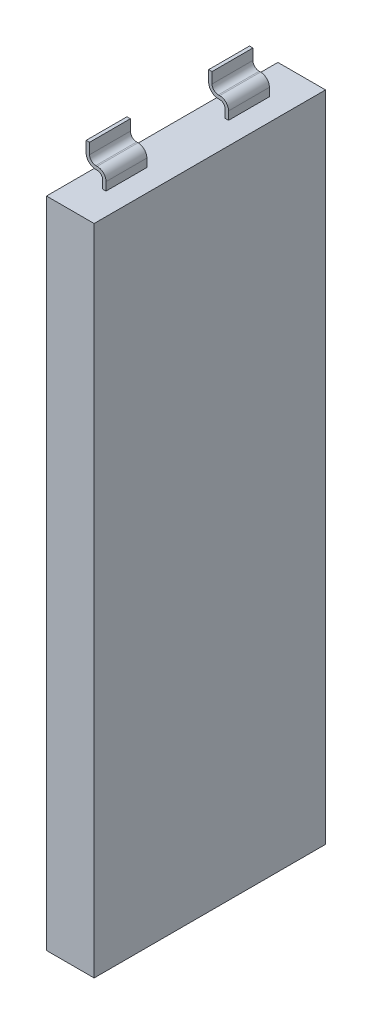
ISO-10303-21;
HEADER;
FILE_DESCRIPTION(('STEP AP214'),'2;1');
FILE_NAME('part.step','',(''),(''),'','','');
FILE_SCHEMA(('AUTOMOTIVE_DESIGN { 1 0 10303 214 1 1 1 1 }'));
ENDSEC;
DATA;
#1=APPLICATION_CONTEXT('core data for automotive mechanical design processes');
#2=APPLICATION_PROTOCOL_DEFINITION('international standard','automotive_design',2000,#1);
#3=PRODUCT_CONTEXT('',#1,'mechanical');
#4=PRODUCT('Part','Part','',(#3));
#5=PRODUCT_RELATED_PRODUCT_CATEGORY('part','',(#4));
#6=PRODUCT_DEFINITION_FORMATION('','',#4);
#7=PRODUCT_DEFINITION_CONTEXT('part definition',#1,'design');
#8=PRODUCT_DEFINITION('design','',#6,#7);
#9=PRODUCT_DEFINITION_SHAPE('','',#8);
#10=(LENGTH_UNIT() NAMED_UNIT(*) SI_UNIT(.MILLI.,.METRE.));
#11=(NAMED_UNIT(*) PLANE_ANGLE_UNIT() SI_UNIT($,.RADIAN.));
#12=(NAMED_UNIT(*) SI_UNIT($,.STERADIAN.) SOLID_ANGLE_UNIT());
#13=UNCERTAINTY_MEASURE_WITH_UNIT(LENGTH_MEASURE(1.E-05),#10,'distance_accuracy_value','');
#14=(GEOMETRIC_REPRESENTATION_CONTEXT(3) GLOBAL_UNCERTAINTY_ASSIGNED_CONTEXT((#13)) GLOBAL_UNIT_ASSIGNED_CONTEXT((#10,
#11,#12)) REPRESENTATION_CONTEXT('',''));
#15=CARTESIAN_POINT('',(0.,0.,0.));
#16=DIRECTION('',(0.,0.,1.));
#17=DIRECTION('',(1.,0.,0.));
#18=AXIS2_PLACEMENT_3D('',#15,#16,#17);
#19=CARTESIAN_POINT('',(7.,48.,17.));
#20=DIRECTION('',(0.,0.,-1.));
#21=DIRECTION('',(0.,1.,0.));
#22=AXIS2_PLACEMENT_3D('',#19,#20,#21);
#23=PLANE('',#22);
#24=DIRECTION('',(0.,-1.,0.));
#25=VECTOR('',#24,1.);
#26=CARTESIAN_POINT('',(0.,48.,17.));
#27=LINE('',#26,#25);
#28=CARTESIAN_POINT('',(0.,48.,17.));
#29=VERTEX_POINT('',#28);
#30=CARTESIAN_POINT('',(0.,-48.,17.));
#31=VERTEX_POINT('',#30);
#32=EDGE_CURVE('E407',#29,#31,#27,.T.);
#33=ORIENTED_EDGE('',*,*,#32,.T.);
#34=DIRECTION('',(-1.,0.,0.));
#35=VECTOR('',#34,1.);
#36=CARTESIAN_POINT('',(7.,-48.,17.));
#37=LINE('',#36,#35);
#38=CARTESIAN_POINT('',(7.,-48.,17.));
#39=VERTEX_POINT('',#38);
#40=EDGE_CURVE('E11',#39,#31,#37,.T.);
#41=ORIENTED_EDGE('',*,*,#40,.F.);
#42=DIRECTION('',(0.,-1.,0.));
#43=VECTOR('',#42,1.);
#44=CARTESIAN_POINT('',(7.,48.,17.));
#45=LINE('',#44,#43);
#46=CARTESIAN_POINT('',(7.,48.,17.));
#47=VERTEX_POINT('',#46);
#48=EDGE_CURVE('E408',#47,#39,#45,.T.);
#49=ORIENTED_EDGE('',*,*,#48,.F.);
#50=DIRECTION('',(-1.,0.,0.));
#51=VECTOR('',#50,1.);
#52=CARTESIAN_POINT('',(7.,48.,17.));
#53=LINE('',#52,#51);
#54=EDGE_CURVE('E418',#47,#29,#53,.T.);
#55=ORIENTED_EDGE('',*,*,#54,.T.);
#56=EDGE_LOOP('',(#33,#41,#49,#55));
#57=FACE_BOUND('',#56,.T.);
#58=ADVANCED_FACE('F36',(#57),#23,.F.);
#59=CARTESIAN_POINT('',(7.,-48.,17.));
#60=DIRECTION('',(0.,1.,0.));
#61=DIRECTION('',(0.,0.,1.));
#62=AXIS2_PLACEMENT_3D('',#59,#60,#61);
#63=PLANE('',#62);
#64=DIRECTION('',(0.,0.,-1.));
#65=VECTOR('',#64,1.);
#66=CARTESIAN_POINT('',(0.,-48.,17.));
#67=LINE('',#66,#65);
#68=CARTESIAN_POINT('',(0.,-48.,-17.));
#69=VERTEX_POINT('',#68);
#70=EDGE_CURVE('E421',#31,#69,#67,.T.);
#71=ORIENTED_EDGE('',*,*,#70,.T.);
#72=DIRECTION('',(-1.,0.,0.));
#73=VECTOR('',#72,1.);
#74=CARTESIAN_POINT('',(7.,-48.,-17.));
#75=LINE('',#74,#73);
#76=CARTESIAN_POINT('',(7.,-48.,-17.));
#77=VERTEX_POINT('',#76);
#78=EDGE_CURVE('E43',#77,#69,#75,.T.);
#79=ORIENTED_EDGE('',*,*,#78,.F.);
#80=DIRECTION('',(0.,0.,-1.));
#81=VECTOR('',#80,1.);
#82=CARTESIAN_POINT('',(7.,-48.,17.));
#83=LINE('',#82,#81);
#84=EDGE_CURVE('E411',#39,#77,#83,.T.);
#85=ORIENTED_EDGE('',*,*,#84,.F.);
#86=ORIENTED_EDGE('',*,*,#40,.T.);
#87=EDGE_LOOP('',(#71,#79,#85,#86));
#88=FACE_BOUND('',#87,.T.);
#89=ADVANCED_FACE('F451',(#88),#63,.F.);
#90=CARTESIAN_POINT('',(7.,48.,-17.));
#91=DIRECTION('',(0.,0.,1.));
#92=DIRECTION('',(0.,-1.,0.));
#93=AXIS2_PLACEMENT_3D('',#90,#91,#92);
#94=PLANE('',#93);
#95=DIRECTION('',(0.,1.,0.));
#96=VECTOR('',#95,1.);
#97=CARTESIAN_POINT('',(0.,48.,-17.));
#98=LINE('',#97,#96);
#99=CARTESIAN_POINT('',(0.,48.,-17.));
#100=VERTEX_POINT('',#99);
#101=EDGE_CURVE('E423',#69,#100,#98,.T.);
#102=ORIENTED_EDGE('',*,*,#101,.T.);
#103=DIRECTION('',(-1.,0.,0.));
#104=VECTOR('',#103,1.);
#105=CARTESIAN_POINT('',(7.,48.,-17.));
#106=LINE('',#105,#104);
#107=CARTESIAN_POINT('',(7.,48.,-17.));
#108=VERTEX_POINT('',#107);
#109=EDGE_CURVE('E428',#108,#100,#106,.T.);
#110=ORIENTED_EDGE('',*,*,#109,.F.);
#111=DIRECTION('',(0.,1.,0.));
#112=VECTOR('',#111,1.);
#113=CARTESIAN_POINT('',(7.,48.,-17.));
#114=LINE('',#113,#112);
#115=EDGE_CURVE('E414',#77,#108,#114,.T.);
#116=ORIENTED_EDGE('',*,*,#115,.F.);
#117=ORIENTED_EDGE('',*,*,#78,.T.);
#118=EDGE_LOOP('',(#102,#110,#116,#117));
#119=FACE_BOUND('',#118,.T.);
#120=ADVANCED_FACE('F435',(#119),#94,.F.);
#121=CARTESIAN_POINT('',(7.,48.,17.));
#122=DIRECTION('',(0.,-1.,0.));
#123=DIRECTION('',(0.,0.,-1.));
#124=AXIS2_PLACEMENT_3D('',#121,#122,#123);
#125=PLANE('',#124);
#126=DIRECTION('',(0.,0.,1.));
#127=VECTOR('',#126,1.);
#128=CARTESIAN_POINT('',(3.25,48.,-12.));
#129=LINE('',#128,#127);
#130=CARTESIAN_POINT('',(3.25,48.,-12.));
#131=VERTEX_POINT('',#130);
#132=CARTESIAN_POINT('',(3.25,48.,-6.));
#133=VERTEX_POINT('',#132);
#134=EDGE_CURVE('E50',#131,#133,#129,.T.);
#135=ORIENTED_EDGE('',*,*,#134,.F.);
#136=DIRECTION('',(1.,0.,0.));
#137=VECTOR('',#136,1.);
#138=CARTESIAN_POINT('',(3.25,48.,-12.));
#139=LINE('',#138,#137);
#140=CARTESIAN_POINT('',(3.75,48.,-12.));
#141=VERTEX_POINT('',#140);
#142=EDGE_CURVE('E54',#131,#141,#139,.T.);
#143=ORIENTED_EDGE('',*,*,#142,.T.);
#144=DIRECTION('',(0.,0.,1.));
#145=VECTOR('',#144,1.);
#146=CARTESIAN_POINT('',(3.75,48.,-12.));
#147=LINE('',#146,#145);
#148=CARTESIAN_POINT('',(3.75,48.,-6.));
#149=VERTEX_POINT('',#148);
#150=EDGE_CURVE('E268',#141,#149,#147,.T.);
#151=ORIENTED_EDGE('',*,*,#150,.T.);
#152=DIRECTION('',(1.,0.,0.));
#153=VECTOR('',#152,1.);
#154=CARTESIAN_POINT('',(3.25,48.,-6.));
#155=LINE('',#154,#153);
#156=EDGE_CURVE('E269',#133,#149,#155,.T.);
#157=ORIENTED_EDGE('',*,*,#156,.F.);
#158=EDGE_LOOP('',(#135,#143,#151,#157));
#159=FACE_BOUND('',#158,.T.);
#160=DIRECTION('',(0.,0.,-1.));
#161=VECTOR('',#160,1.);
#162=CARTESIAN_POINT('',(3.75,48.,12.));
#163=LINE('',#162,#161);
#164=CARTESIAN_POINT('',(3.75,48.,12.));
#165=VERTEX_POINT('',#164);
#166=CARTESIAN_POINT('',(3.75,48.,6.));
#167=VERTEX_POINT('',#166);
#168=EDGE_CURVE('E404',#165,#167,#163,.T.);
#169=ORIENTED_EDGE('',*,*,#168,.F.);
#170=DIRECTION('',(1.,0.,0.));
#171=VECTOR('',#170,1.);
#172=CARTESIAN_POINT('',(3.25,48.,12.));
#173=LINE('',#172,#171);
#174=CARTESIAN_POINT('',(3.25,48.,12.));
#175=VERTEX_POINT('',#174);
#176=EDGE_CURVE('E322',#175,#165,#173,.T.);
#177=ORIENTED_EDGE('',*,*,#176,.F.);
#178=DIRECTION('',(0.,0.,-1.));
#179=VECTOR('',#178,1.);
#180=CARTESIAN_POINT('',(3.25,48.,12.));
#181=LINE('',#180,#179);
#182=CARTESIAN_POINT('',(3.25,48.,6.));
#183=VERTEX_POINT('',#182);
#184=EDGE_CURVE('E349',#175,#183,#181,.T.);
#185=ORIENTED_EDGE('',*,*,#184,.T.);
#186=DIRECTION('',(1.,0.,0.));
#187=VECTOR('',#186,1.);
#188=CARTESIAN_POINT('',(3.25,48.,6.));
#189=LINE('',#188,#187);
#190=EDGE_CURVE('E321',#183,#167,#189,.T.);
#191=ORIENTED_EDGE('',*,*,#190,.T.);
#192=EDGE_LOOP('',(#169,#177,#185,#191));
#193=FACE_BOUND('',#192,.T.);
#194=DIRECTION('',(0.,0.,1.));
#195=VECTOR('',#194,1.);
#196=CARTESIAN_POINT('',(0.,48.,17.));
#197=LINE('',#196,#195);
#198=EDGE_CURVE('E412',#100,#29,#197,.T.);
#199=ORIENTED_EDGE('',*,*,#198,.T.);
#200=ORIENTED_EDGE('',*,*,#54,.F.);
#201=DIRECTION('',(0.,0.,1.));
#202=VECTOR('',#201,1.);
#203=CARTESIAN_POINT('',(7.,48.,17.));
#204=LINE('',#203,#202);
#205=EDGE_CURVE('E416',#108,#47,#204,.T.);
#206=ORIENTED_EDGE('',*,*,#205,.F.);
#207=ORIENTED_EDGE('',*,*,#109,.T.);
#208=EDGE_LOOP('',(#199,#200,#206,#207));
#209=FACE_BOUND('',#208,.T.);
#210=ADVANCED_FACE('F444',(#159,#193,#209),#125,.F.);
#211=CARTESIAN_POINT('',(7.,0.,0.));
#212=DIRECTION('',(1.,0.,0.));
#213=DIRECTION('',(0.,0.,-1.));
#214=AXIS2_PLACEMENT_3D('',#211,#212,#213);
#215=PLANE('',#214);
#216=ORIENTED_EDGE('',*,*,#48,.T.);
#217=ORIENTED_EDGE('',*,*,#84,.T.);
#218=ORIENTED_EDGE('',*,*,#115,.T.);
#219=ORIENTED_EDGE('',*,*,#205,.T.);
#220=EDGE_LOOP('',(#216,#217,#218,#219));
#221=FACE_BOUND('',#220,.T.);
#222=ADVANCED_FACE('F450',(#221),#215,.T.);
#223=CARTESIAN_POINT('',(0.,0.,0.));
#224=DIRECTION('',(1.,0.,0.));
#225=DIRECTION('',(0.,0.,-1.));
#226=AXIS2_PLACEMENT_3D('',#223,#224,#225);
#227=PLANE('',#226);
#228=ORIENTED_EDGE('',*,*,#32,.F.);
#229=ORIENTED_EDGE('',*,*,#198,.F.);
#230=ORIENTED_EDGE('',*,*,#101,.F.);
#231=ORIENTED_EDGE('',*,*,#70,.F.);
#232=EDGE_LOOP('',(#228,#229,#230,#231));
#233=FACE_BOUND('',#232,.T.);
#234=ADVANCED_FACE('F441',(#233),#227,.F.);
#235=CARTESIAN_POINT('',(3.75,48.,12.));
#236=DIRECTION('',(-1.,0.,0.));
#237=DIRECTION('',(0.,-1.,0.));
#238=AXIS2_PLACEMENT_3D('',#235,#236,#237);
#239=PLANE('',#238);
#240=DIRECTION('',(0.,1.,0.));
#241=VECTOR('',#240,1.);
#242=CARTESIAN_POINT('',(3.75,48.,6.));
#243=LINE('',#242,#241);
#244=CARTESIAN_POINT('',(3.75,49.2,6.));
#245=VERTEX_POINT('',#244);
#246=EDGE_CURVE('E351',#167,#245,#243,.T.);
#247=ORIENTED_EDGE('',*,*,#246,.T.);
#248=DIRECTION('',(0.,0.,-1.));
#249=VECTOR('',#248,1.);
#250=CARTESIAN_POINT('',(3.75,49.2,12.));
#251=LINE('',#250,#249);
#252=CARTESIAN_POINT('',(3.75,49.2,12.));
#253=VERTEX_POINT('',#252);
#254=EDGE_CURVE('E401',#253,#245,#251,.T.);
#255=ORIENTED_EDGE('',*,*,#254,.F.);
#256=DIRECTION('',(0.,1.,0.));
#257=VECTOR('',#256,1.);
#258=CARTESIAN_POINT('',(3.75,48.,12.));
#259=LINE('',#258,#257);
#260=EDGE_CURVE('E325',#165,#253,#259,.T.);
#261=ORIENTED_EDGE('',*,*,#260,.F.);
#262=ORIENTED_EDGE('',*,*,#168,.T.);
#263=EDGE_LOOP('',(#247,#255,#261,#262));
#264=FACE_BOUND('',#263,.T.);
#265=ADVANCED_FACE('F463',(#264),#239,.F.);
#266=CARTESIAN_POINT('',(2.45,49.2,12.));
#267=DIRECTION('',(0.,0.,-1.));
#268=DIRECTION('',(-1.,0.,0.));
#269=AXIS2_PLACEMENT_3D('',#266,#267,#268);
#270=CYLINDRICAL_SURFACE('',#269,1.3);
#271=CARTESIAN_POINT('',(2.45,49.2,6.));
#272=DIRECTION('',(0.,0.,1.));
#273=DIRECTION('',(1.,0.,0.));
#274=AXIS2_PLACEMENT_3D('',#271,#272,#273);
#275=CIRCLE('',#274,1.3);
#276=CARTESIAN_POINT('',(2.44999999999999,50.5,6.));
#277=VERTEX_POINT('',#276);
#278=EDGE_CURVE('E353',#245,#277,#275,.T.);
#279=ORIENTED_EDGE('',*,*,#278,.T.);
#280=DIRECTION('',(0.,0.,-1.));
#281=VECTOR('',#280,1.);
#282=CARTESIAN_POINT('',(2.44999999999999,50.5,12.));
#283=LINE('',#282,#281);
#284=CARTESIAN_POINT('',(2.44999999999999,50.5,12.));
#285=VERTEX_POINT('',#284);
#286=EDGE_CURVE('E398',#285,#277,#283,.T.);
#287=ORIENTED_EDGE('',*,*,#286,.F.);
#288=CARTESIAN_POINT('',(2.45,49.2,12.));
#289=DIRECTION('',(0.,0.,1.));
#290=DIRECTION('',(1.,0.,0.));
#291=AXIS2_PLACEMENT_3D('',#288,#289,#290);
#292=CIRCLE('',#291,1.3);
#293=EDGE_CURVE('E328',#253,#285,#292,.T.);
#294=ORIENTED_EDGE('',*,*,#293,.F.);
#295=ORIENTED_EDGE('',*,*,#254,.T.);
#296=EDGE_LOOP('',(#279,#287,#294,#295));
#297=FACE_BOUND('',#296,.T.);
#298=ADVANCED_FACE('F468',(#297),#270,.T.);
#299=CARTESIAN_POINT('',(2.25000000000001,50.5,12.));
#300=DIRECTION('',(0.,-1.,0.));
#301=DIRECTION('',(0.,0.,-1.));
#302=AXIS2_PLACEMENT_3D('',#299,#300,#301);
#303=PLANE('',#302);
#304=DIRECTION('',(-1.,0.,0.));
#305=VECTOR('',#304,1.);
#306=CARTESIAN_POINT('',(2.25000000000001,50.5,6.));
#307=LINE('',#306,#305);
#308=CARTESIAN_POINT('',(2.25000000000001,50.5,6.));
#309=VERTEX_POINT('',#308);
#310=EDGE_CURVE('E355',#277,#309,#307,.T.);
#311=ORIENTED_EDGE('',*,*,#310,.T.);
#312=DIRECTION('',(0.,0.,-1.));
#313=VECTOR('',#312,1.);
#314=CARTESIAN_POINT('',(2.25000000000001,50.5,12.));
#315=LINE('',#314,#313);
#316=CARTESIAN_POINT('',(2.25000000000001,50.5,12.));
#317=VERTEX_POINT('',#316);
#318=EDGE_CURVE('E395',#317,#309,#315,.T.);
#319=ORIENTED_EDGE('',*,*,#318,.F.);
#320=DIRECTION('',(-1.,0.,0.));
#321=VECTOR('',#320,1.);
#322=CARTESIAN_POINT('',(2.25000000000001,50.5,12.));
#323=LINE('',#322,#321);
#324=EDGE_CURVE('E330',#285,#317,#323,.T.);
#325=ORIENTED_EDGE('',*,*,#324,.F.);
#326=ORIENTED_EDGE('',*,*,#286,.T.);
#327=EDGE_LOOP('',(#311,#319,#325,#326));
#328=FACE_BOUND('',#327,.T.);
#329=ADVANCED_FACE('F472',(#328),#303,.F.);
#330=CARTESIAN_POINT('',(2.25,51.42,12.));
#331=DIRECTION('',(0.,0.,-1.));
#332=DIRECTION('',(-1.,0.,0.));
#333=AXIS2_PLACEMENT_3D('',#330,#331,#332);
#334=CYLINDRICAL_SURFACE('',#333,0.919999999999999);
#335=CARTESIAN_POINT('',(2.25,51.42,6.));
#336=DIRECTION('',(0.,0.,-1.));
#337=DIRECTION('',(1.,0.,0.));
#338=AXIS2_PLACEMENT_3D('',#335,#336,#337);
#339=CIRCLE('',#338,0.919999999999999);
#340=CARTESIAN_POINT('',(1.33,51.42,6.));
#341=VERTEX_POINT('',#340);
#342=EDGE_CURVE('E357',#309,#341,#339,.T.);
#343=ORIENTED_EDGE('',*,*,#342,.T.);
#344=DIRECTION('',(0.,0.,-1.));
#345=VECTOR('',#344,1.);
#346=CARTESIAN_POINT('',(1.33,51.42,12.));
#347=LINE('',#346,#345);
#348=CARTESIAN_POINT('',(1.33,51.42,12.));
#349=VERTEX_POINT('',#348);
#350=EDGE_CURVE('E392',#349,#341,#347,.T.);
#351=ORIENTED_EDGE('',*,*,#350,.F.);
#352=CARTESIAN_POINT('',(2.25,51.42,12.));
#353=DIRECTION('',(0.,0.,-1.));
#354=DIRECTION('',(1.,0.,0.));
#355=AXIS2_PLACEMENT_3D('',#352,#353,#354);
#356=CIRCLE('',#355,0.919999999999999);
#357=EDGE_CURVE('E332',#317,#349,#356,.T.);
#358=ORIENTED_EDGE('',*,*,#357,.F.);
#359=ORIENTED_EDGE('',*,*,#318,.T.);
#360=EDGE_LOOP('',(#343,#351,#358,#359));
#361=FACE_BOUND('',#360,.T.);
#362=ADVANCED_FACE('F476',(#361),#334,.F.);
#363=CARTESIAN_POINT('',(1.33,53.,12.));
#364=DIRECTION('',(-1.,0.,0.));
#365=DIRECTION('',(0.,0.,1.));
#366=AXIS2_PLACEMENT_3D('',#363,#364,#365);
#367=PLANE('',#366);
#368=DIRECTION('',(0.,1.,0.));
#369=VECTOR('',#368,1.);
#370=CARTESIAN_POINT('',(1.33,53.,6.));
#371=LINE('',#370,#369);
#372=CARTESIAN_POINT('',(1.33,53.,6.));
#373=VERTEX_POINT('',#372);
#374=EDGE_CURVE('E359',#341,#373,#371,.T.);
#375=ORIENTED_EDGE('',*,*,#374,.T.);
#376=DIRECTION('',(0.,0.,-1.));
#377=VECTOR('',#376,1.);
#378=CARTESIAN_POINT('',(1.33,53.,12.));
#379=LINE('',#378,#377);
#380=CARTESIAN_POINT('',(1.33,53.,12.));
#381=VERTEX_POINT('',#380);
#382=EDGE_CURVE('E389',#381,#373,#379,.T.);
#383=ORIENTED_EDGE('',*,*,#382,.F.);
#384=DIRECTION('',(0.,1.,0.));
#385=VECTOR('',#384,1.);
#386=CARTESIAN_POINT('',(1.33,53.,12.));
#387=LINE('',#386,#385);
#388=EDGE_CURVE('E334',#349,#381,#387,.T.);
#389=ORIENTED_EDGE('',*,*,#388,.F.);
#390=ORIENTED_EDGE('',*,*,#350,.T.);
#391=EDGE_LOOP('',(#375,#383,#389,#390));
#392=FACE_BOUND('',#391,.T.);
#393=ADVANCED_FACE('F480',(#392),#367,.F.);
#394=CARTESIAN_POINT('',(0.83,53.,12.));
#395=DIRECTION('',(0.,-1.,0.));
#396=DIRECTION('',(0.,0.,-1.));
#397=AXIS2_PLACEMENT_3D('',#394,#395,#396);
#398=PLANE('',#397);
#399=DIRECTION('',(-1.,0.,0.));
#400=VECTOR('',#399,1.);
#401=CARTESIAN_POINT('',(0.83,53.,6.));
#402=LINE('',#401,#400);
#403=CARTESIAN_POINT('',(0.83,53.,6.));
#404=VERTEX_POINT('',#403);
#405=EDGE_CURVE('E361',#373,#404,#402,.T.);
#406=ORIENTED_EDGE('',*,*,#405,.T.);
#407=DIRECTION('',(0.,0.,-1.));
#408=VECTOR('',#407,1.);
#409=CARTESIAN_POINT('',(0.83,53.,12.));
#410=LINE('',#409,#408);
#411=CARTESIAN_POINT('',(0.83,53.,12.));
#412=VERTEX_POINT('',#411);
#413=EDGE_CURVE('E386',#412,#404,#410,.T.);
#414=ORIENTED_EDGE('',*,*,#413,.F.);
#415=DIRECTION('',(-1.,0.,0.));
#416=VECTOR('',#415,1.);
#417=CARTESIAN_POINT('',(0.83,53.,12.));
#418=LINE('',#417,#416);
#419=EDGE_CURVE('E336',#381,#412,#418,.T.);
#420=ORIENTED_EDGE('',*,*,#419,.F.);
#421=ORIENTED_EDGE('',*,*,#382,.T.);
#422=EDGE_LOOP('',(#406,#414,#420,#421));
#423=FACE_BOUND('',#422,.T.);
#424=ADVANCED_FACE('F484',(#423),#398,.F.);
#425=CARTESIAN_POINT('',(0.83,53.,12.));
#426=DIRECTION('',(1.,0.,0.));
#427=DIRECTION('',(0.,1.,0.));
#428=AXIS2_PLACEMENT_3D('',#425,#426,#427);
#429=PLANE('',#428);
#430=DIRECTION('',(0.,-1.,0.));
#431=VECTOR('',#430,1.);
#432=CARTESIAN_POINT('',(0.83,53.,6.));
#433=LINE('',#432,#431);
#434=CARTESIAN_POINT('',(0.830000000000002,51.42,6.));
#435=VERTEX_POINT('',#434);
#436=EDGE_CURVE('E363',#404,#435,#433,.T.);
#437=ORIENTED_EDGE('',*,*,#436,.T.);
#438=DIRECTION('',(0.,0.,-1.));
#439=VECTOR('',#438,1.);
#440=CARTESIAN_POINT('',(0.830000000000002,51.42,12.));
#441=LINE('',#440,#439);
#442=CARTESIAN_POINT('',(0.830000000000002,51.42,12.));
#443=VERTEX_POINT('',#442);
#444=EDGE_CURVE('E383',#443,#435,#441,.T.);
#445=ORIENTED_EDGE('',*,*,#444,.F.);
#446=DIRECTION('',(0.,-1.,0.));
#447=VECTOR('',#446,1.);
#448=CARTESIAN_POINT('',(0.83,53.,12.));
#449=LINE('',#448,#447);
#450=EDGE_CURVE('E338',#412,#443,#449,.T.);
#451=ORIENTED_EDGE('',*,*,#450,.F.);
#452=ORIENTED_EDGE('',*,*,#413,.T.);
#453=EDGE_LOOP('',(#437,#445,#451,#452));
#454=FACE_BOUND('',#453,.T.);
#455=ADVANCED_FACE('F488',(#454),#429,.F.);
#456=CARTESIAN_POINT('',(2.25,51.42,12.));
#457=DIRECTION('',(0.,0.,-1.));
#458=DIRECTION('',(-1.,0.,0.));
#459=AXIS2_PLACEMENT_3D('',#456,#457,#458);
#460=CYLINDRICAL_SURFACE('',#459,1.42);
#461=CARTESIAN_POINT('',(2.25,51.42,6.));
#462=DIRECTION('',(0.,0.,1.));
#463=DIRECTION('',(1.,0.,0.));
#464=AXIS2_PLACEMENT_3D('',#461,#462,#463);
#465=CIRCLE('',#464,1.42);
#466=CARTESIAN_POINT('',(2.25000000000001,50.,6.));
#467=VERTEX_POINT('',#466);
#468=EDGE_CURVE('E365',#435,#467,#465,.T.);
#469=ORIENTED_EDGE('',*,*,#468,.T.);
#470=DIRECTION('',(0.,0.,-1.));
#471=VECTOR('',#470,1.);
#472=CARTESIAN_POINT('',(2.25000000000001,50.,12.));
#473=LINE('',#472,#471);
#474=CARTESIAN_POINT('',(2.25000000000001,50.,12.));
#475=VERTEX_POINT('',#474);
#476=EDGE_CURVE('E380',#475,#467,#473,.T.);
#477=ORIENTED_EDGE('',*,*,#476,.F.);
#478=CARTESIAN_POINT('',(2.25,51.42,12.));
#479=DIRECTION('',(0.,0.,1.));
#480=DIRECTION('',(1.,0.,0.));
#481=AXIS2_PLACEMENT_3D('',#478,#479,#480);
#482=CIRCLE('',#481,1.42);
#483=EDGE_CURVE('E340',#443,#475,#482,.T.);
#484=ORIENTED_EDGE('',*,*,#483,.F.);
#485=ORIENTED_EDGE('',*,*,#444,.T.);
#486=EDGE_LOOP('',(#469,#477,#484,#485));
#487=FACE_BOUND('',#486,.T.);
#488=ADVANCED_FACE('F492',(#487),#460,.T.);
#489=CARTESIAN_POINT('',(2.25000000000001,50.,12.));
#490=DIRECTION('',(0.,1.,0.));
#491=DIRECTION('',(0.,0.,1.));
#492=AXIS2_PLACEMENT_3D('',#489,#490,#491);
#493=PLANE('',#492);
#494=DIRECTION('',(1.,0.,0.));
#495=VECTOR('',#494,1.);
#496=CARTESIAN_POINT('',(2.25000000000001,50.,6.));
#497=LINE('',#496,#495);
#498=CARTESIAN_POINT('',(2.44999999999999,50.,6.));
#499=VERTEX_POINT('',#498);
#500=EDGE_CURVE('E367',#467,#499,#497,.T.);
#501=ORIENTED_EDGE('',*,*,#500,.T.);
#502=DIRECTION('',(0.,0.,-1.));
#503=VECTOR('',#502,1.);
#504=CARTESIAN_POINT('',(2.44999999999999,50.,12.));
#505=LINE('',#504,#503);
#506=CARTESIAN_POINT('',(2.44999999999999,50.,12.));
#507=VERTEX_POINT('',#506);
#508=EDGE_CURVE('E377',#507,#499,#505,.T.);
#509=ORIENTED_EDGE('',*,*,#508,.F.);
#510=DIRECTION('',(1.,0.,0.));
#511=VECTOR('',#510,1.);
#512=CARTESIAN_POINT('',(2.25000000000001,50.,12.));
#513=LINE('',#512,#511);
#514=EDGE_CURVE('E342',#475,#507,#513,.T.);
#515=ORIENTED_EDGE('',*,*,#514,.F.);
#516=ORIENTED_EDGE('',*,*,#476,.T.);
#517=EDGE_LOOP('',(#501,#509,#515,#516));
#518=FACE_BOUND('',#517,.T.);
#519=ADVANCED_FACE('F496',(#518),#493,.F.);
#520=CARTESIAN_POINT('',(2.45,49.2,12.));
#521=DIRECTION('',(0.,0.,-1.));
#522=DIRECTION('',(-1.,0.,0.));
#523=AXIS2_PLACEMENT_3D('',#520,#521,#522);
#524=CYLINDRICAL_SURFACE('',#523,0.800000000000001);
#525=CARTESIAN_POINT('',(2.45,49.2,6.));
#526=DIRECTION('',(0.,0.,-1.));
#527=DIRECTION('',(1.,0.,0.));
#528=AXIS2_PLACEMENT_3D('',#525,#526,#527);
#529=CIRCLE('',#528,0.800000000000001);
#530=CARTESIAN_POINT('',(3.25,49.2,6.));
#531=VERTEX_POINT('',#530);
#532=EDGE_CURVE('E369',#499,#531,#529,.T.);
#533=ORIENTED_EDGE('',*,*,#532,.T.);
#534=DIRECTION('',(0.,0.,-1.));
#535=VECTOR('',#534,1.);
#536=CARTESIAN_POINT('',(3.25,49.2,12.));
#537=LINE('',#536,#535);
#538=CARTESIAN_POINT('',(3.25,49.2,12.));
#539=VERTEX_POINT('',#538);
#540=EDGE_CURVE('E374',#539,#531,#537,.T.);
#541=ORIENTED_EDGE('',*,*,#540,.F.);
#542=CARTESIAN_POINT('',(2.45,49.2,12.));
#543=DIRECTION('',(0.,0.,-1.));
#544=DIRECTION('',(1.,0.,0.));
#545=AXIS2_PLACEMENT_3D('',#542,#543,#544);
#546=CIRCLE('',#545,0.800000000000001);
#547=EDGE_CURVE('E344',#507,#539,#546,.T.);
#548=ORIENTED_EDGE('',*,*,#547,.F.);
#549=ORIENTED_EDGE('',*,*,#508,.T.);
#550=EDGE_LOOP('',(#533,#541,#548,#549));
#551=FACE_BOUND('',#550,.T.);
#552=ADVANCED_FACE('F500',(#551),#524,.F.);
#553=CARTESIAN_POINT('',(3.25,48.,12.));
#554=DIRECTION('',(1.,0.,0.));
#555=DIRECTION('',(0.,1.,0.));
#556=AXIS2_PLACEMENT_3D('',#553,#554,#555);
#557=PLANE('',#556);
#558=DIRECTION('',(0.,-1.,0.));
#559=VECTOR('',#558,1.);
#560=CARTESIAN_POINT('',(3.25,48.,6.));
#561=LINE('',#560,#559);
#562=EDGE_CURVE('E326',#531,#183,#561,.T.);
#563=ORIENTED_EDGE('',*,*,#562,.T.);
#564=ORIENTED_EDGE('',*,*,#184,.F.);
#565=DIRECTION('',(0.,-1.,0.));
#566=VECTOR('',#565,1.);
#567=CARTESIAN_POINT('',(3.25,48.,12.));
#568=LINE('',#567,#566);
#569=EDGE_CURVE('E346',#539,#175,#568,.T.);
#570=ORIENTED_EDGE('',*,*,#569,.F.);
#571=ORIENTED_EDGE('',*,*,#540,.T.);
#572=EDGE_LOOP('',(#563,#564,#570,#571));
#573=FACE_BOUND('',#572,.T.);
#574=ADVANCED_FACE('F504',(#573),#557,.F.);
#575=CARTESIAN_POINT('',(2.45,49.2,12.));
#576=DIRECTION('',(0.,0.,1.));
#577=DIRECTION('',(1.,0.,0.));
#578=AXIS2_PLACEMENT_3D('',#575,#576,#577);
#579=PLANE('',#578);
#580=ORIENTED_EDGE('',*,*,#176,.T.);
#581=ORIENTED_EDGE('',*,*,#260,.T.);
#582=ORIENTED_EDGE('',*,*,#293,.T.);
#583=ORIENTED_EDGE('',*,*,#324,.T.);
#584=ORIENTED_EDGE('',*,*,#357,.T.);
#585=ORIENTED_EDGE('',*,*,#388,.T.);
#586=ORIENTED_EDGE('',*,*,#419,.T.);
#587=ORIENTED_EDGE('',*,*,#450,.T.);
#588=ORIENTED_EDGE('',*,*,#483,.T.);
#589=ORIENTED_EDGE('',*,*,#514,.T.);
#590=ORIENTED_EDGE('',*,*,#547,.T.);
#591=ORIENTED_EDGE('',*,*,#569,.T.);
#592=EDGE_LOOP('',(#580,#581,#582,#583,#584,#585,#586,#587,#588,#589,#590,#591));
#593=FACE_BOUND('',#592,.T.);
#594=ADVANCED_FACE('F508',(#593),#579,.T.);
#595=CARTESIAN_POINT('',(2.45,49.2,6.));
#596=DIRECTION('',(0.,0.,1.));
#597=DIRECTION('',(1.,0.,0.));
#598=AXIS2_PLACEMENT_3D('',#595,#596,#597);
#599=PLANE('',#598);
#600=ORIENTED_EDGE('',*,*,#190,.F.);
#601=ORIENTED_EDGE('',*,*,#562,.F.);
#602=ORIENTED_EDGE('',*,*,#532,.F.);
#603=ORIENTED_EDGE('',*,*,#500,.F.);
#604=ORIENTED_EDGE('',*,*,#468,.F.);
#605=ORIENTED_EDGE('',*,*,#436,.F.);
#606=ORIENTED_EDGE('',*,*,#405,.F.);
#607=ORIENTED_EDGE('',*,*,#374,.F.);
#608=ORIENTED_EDGE('',*,*,#342,.F.);
#609=ORIENTED_EDGE('',*,*,#310,.F.);
#610=ORIENTED_EDGE('',*,*,#278,.F.);
#611=ORIENTED_EDGE('',*,*,#246,.F.);
#612=EDGE_LOOP('',(#600,#601,#602,#603,#604,#605,#606,#607,#608,#609,#610,#611));
#613=FACE_BOUND('',#612,.T.);
#614=ADVANCED_FACE('F510',(#613),#599,.F.);
#615=CARTESIAN_POINT('',(3.25,48.,-12.));
#616=DIRECTION('',(-1.,0.,0.));
#617=DIRECTION('',(0.,-1.,0.));
#618=AXIS2_PLACEMENT_3D('',#615,#616,#617);
#619=PLANE('',#618);
#620=DIRECTION('',(0.,-1.,0.));
#621=VECTOR('',#620,1.);
#622=CARTESIAN_POINT('',(3.25,48.,-6.));
#623=LINE('',#622,#621);
#624=CARTESIAN_POINT('',(3.25,49.2,-6.));
#625=VERTEX_POINT('',#624);
#626=EDGE_CURVE('E223',#625,#133,#623,.T.);
#627=ORIENTED_EDGE('',*,*,#626,.F.);
#628=DIRECTION('',(0.,0.,1.));
#629=VECTOR('',#628,1.);
#630=CARTESIAN_POINT('',(3.25,49.2,-12.));
#631=LINE('',#630,#629);
#632=CARTESIAN_POINT('',(3.25,49.2,-12.));
#633=VERTEX_POINT('',#632);
#634=EDGE_CURVE('E218',#633,#625,#631,.T.);
#635=ORIENTED_EDGE('',*,*,#634,.F.);
#636=DIRECTION('',(0.,-1.,0.));
#637=VECTOR('',#636,1.);
#638=CARTESIAN_POINT('',(3.25,48.,-12.));
#639=LINE('',#638,#637);
#640=EDGE_CURVE('E221',#633,#131,#639,.T.);
#641=ORIENTED_EDGE('',*,*,#640,.T.);
#642=ORIENTED_EDGE('',*,*,#134,.T.);
#643=EDGE_LOOP('',(#627,#635,#641,#642));
#644=FACE_BOUND('',#643,.T.);
#645=ADVANCED_FACE('F220',(#644),#619,.T.);
#646=CARTESIAN_POINT('',(2.45,49.2,-12.));
#647=DIRECTION('',(0.,0.,1.));
#648=DIRECTION('',(1.,0.,0.));
#649=AXIS2_PLACEMENT_3D('',#646,#647,#648);
#650=CYLINDRICAL_SURFACE('',#649,0.800000000000001);
#651=CARTESIAN_POINT('',(2.45,49.2,-6.));
#652=DIRECTION('',(0.,0.,-1.));
#653=DIRECTION('',(1.,0.,0.));
#654=AXIS2_PLACEMENT_3D('',#651,#652,#653);
#655=CIRCLE('',#654,0.800000000000001);
#656=CARTESIAN_POINT('',(2.44999999999999,50.,-6.));
#657=VERTEX_POINT('',#656);
#658=EDGE_CURVE('E273',#657,#625,#655,.T.);
#659=ORIENTED_EDGE('',*,*,#658,.F.);
#660=DIRECTION('',(0.,0.,1.));
#661=VECTOR('',#660,1.);
#662=CARTESIAN_POINT('',(2.44999999999999,50.,-12.));
#663=LINE('',#662,#661);
#664=CARTESIAN_POINT('',(2.44999999999999,50.,-12.));
#665=VERTEX_POINT('',#664);
#666=EDGE_CURVE('E228',#665,#657,#663,.T.);
#667=ORIENTED_EDGE('',*,*,#666,.F.);
#668=CARTESIAN_POINT('',(2.45,49.2,-12.));
#669=DIRECTION('',(0.,0.,-1.));
#670=DIRECTION('',(1.,0.,0.));
#671=AXIS2_PLACEMENT_3D('',#668,#669,#670);
#672=CIRCLE('',#671,0.800000000000001);
#673=EDGE_CURVE('E234',#665,#633,#672,.T.);
#674=ORIENTED_EDGE('',*,*,#673,.T.);
#675=ORIENTED_EDGE('',*,*,#634,.T.);
#676=EDGE_LOOP('',(#659,#667,#674,#675));
#677=FACE_BOUND('',#676,.T.);
#678=ADVANCED_FACE('F238',(#677),#650,.F.);
#679=CARTESIAN_POINT('',(2.25000000000001,50.,-12.));
#680=DIRECTION('',(0.,-1.,0.));
#681=DIRECTION('',(0.,0.,-1.));
#682=AXIS2_PLACEMENT_3D('',#679,#680,#681);
#683=PLANE('',#682);
#684=DIRECTION('',(1.,0.,0.));
#685=VECTOR('',#684,1.);
#686=CARTESIAN_POINT('',(2.25000000000001,50.,-6.));
#687=LINE('',#686,#685);
#688=CARTESIAN_POINT('',(2.25000000000001,50.,-6.));
#689=VERTEX_POINT('',#688);
#690=EDGE_CURVE('E275',#689,#657,#687,.T.);
#691=ORIENTED_EDGE('',*,*,#690,.F.);
#692=DIRECTION('',(0.,0.,1.));
#693=VECTOR('',#692,1.);
#694=CARTESIAN_POINT('',(2.25000000000001,50.,-12.));
#695=LINE('',#694,#693);
#696=CARTESIAN_POINT('',(2.25000000000001,50.,-12.));
#697=VERTEX_POINT('',#696);
#698=EDGE_CURVE('E317',#697,#689,#695,.T.);
#699=ORIENTED_EDGE('',*,*,#698,.F.);
#700=DIRECTION('',(1.,0.,0.));
#701=VECTOR('',#700,1.);
#702=CARTESIAN_POINT('',(2.25000000000001,50.,-12.));
#703=LINE('',#702,#701);
#704=EDGE_CURVE('E239',#697,#665,#703,.T.);
#705=ORIENTED_EDGE('',*,*,#704,.T.);
#706=ORIENTED_EDGE('',*,*,#666,.T.);
#707=EDGE_LOOP('',(#691,#699,#705,#706));
#708=FACE_BOUND('',#707,.T.);
#709=ADVANCED_FACE('F521',(#708),#683,.T.);
#710=CARTESIAN_POINT('',(2.25,51.42,-12.));
#711=DIRECTION('',(0.,0.,1.));
#712=DIRECTION('',(1.,0.,0.));
#713=AXIS2_PLACEMENT_3D('',#710,#711,#712);
#714=CYLINDRICAL_SURFACE('',#713,1.42);
#715=CARTESIAN_POINT('',(2.25,51.42,-6.));
#716=DIRECTION('',(0.,0.,1.));
#717=DIRECTION('',(1.,0.,0.));
#718=AXIS2_PLACEMENT_3D('',#715,#716,#717);
#719=CIRCLE('',#718,1.42);
#720=CARTESIAN_POINT('',(0.830000000000002,51.42,-6.));
#721=VERTEX_POINT('',#720);
#722=EDGE_CURVE('E278',#721,#689,#719,.T.);
#723=ORIENTED_EDGE('',*,*,#722,.F.);
#724=DIRECTION('',(0.,0.,1.));
#725=VECTOR('',#724,1.);
#726=CARTESIAN_POINT('',(0.830000000000002,51.42,-12.));
#727=LINE('',#726,#725);
#728=CARTESIAN_POINT('',(0.830000000000002,51.42,-12.));
#729=VERTEX_POINT('',#728);
#730=EDGE_CURVE('E315',#729,#721,#727,.T.);
#731=ORIENTED_EDGE('',*,*,#730,.F.);
#732=CARTESIAN_POINT('',(2.25,51.42,-12.));
#733=DIRECTION('',(0.,0.,1.));
#734=DIRECTION('',(1.,0.,0.));
#735=AXIS2_PLACEMENT_3D('',#732,#733,#734);
#736=CIRCLE('',#735,1.42);
#737=EDGE_CURVE('E241',#729,#697,#736,.T.);
#738=ORIENTED_EDGE('',*,*,#737,.T.);
#739=ORIENTED_EDGE('',*,*,#698,.T.);
#740=EDGE_LOOP('',(#723,#731,#738,#739));
#741=FACE_BOUND('',#740,.T.);
#742=ADVANCED_FACE('F524',(#741),#714,.T.);
#743=CARTESIAN_POINT('',(0.83,53.,-12.));
#744=DIRECTION('',(-1.,0.,0.));
#745=DIRECTION('',(0.,-1.,0.));
#746=AXIS2_PLACEMENT_3D('',#743,#744,#745);
#747=PLANE('',#746);
#748=DIRECTION('',(0.,-1.,0.));
#749=VECTOR('',#748,1.);
#750=CARTESIAN_POINT('',(0.83,53.,-6.));
#751=LINE('',#750,#749);
#752=CARTESIAN_POINT('',(0.83,53.,-6.));
#753=VERTEX_POINT('',#752);
#754=EDGE_CURVE('E281',#753,#721,#751,.T.);
#755=ORIENTED_EDGE('',*,*,#754,.F.);
#756=DIRECTION('',(0.,0.,1.));
#757=VECTOR('',#756,1.);
#758=CARTESIAN_POINT('',(0.83,53.,-12.));
#759=LINE('',#758,#757);
#760=CARTESIAN_POINT('',(0.83,53.,-12.));
#761=VERTEX_POINT('',#760);
#762=EDGE_CURVE('E313',#761,#753,#759,.T.);
#763=ORIENTED_EDGE('',*,*,#762,.F.);
#764=DIRECTION('',(0.,-1.,0.));
#765=VECTOR('',#764,1.);
#766=CARTESIAN_POINT('',(0.83,53.,-12.));
#767=LINE('',#766,#765);
#768=EDGE_CURVE('E247',#761,#729,#767,.T.);
#769=ORIENTED_EDGE('',*,*,#768,.T.);
#770=ORIENTED_EDGE('',*,*,#730,.T.);
#771=EDGE_LOOP('',(#755,#763,#769,#770));
#772=FACE_BOUND('',#771,.T.);
#773=ADVANCED_FACE('F528',(#772),#747,.T.);
#774=CARTESIAN_POINT('',(0.83,53.,-12.));
#775=DIRECTION('',(0.,1.,0.));
#776=DIRECTION('',(0.,0.,1.));
#777=AXIS2_PLACEMENT_3D('',#774,#775,#776);
#778=PLANE('',#777);
#779=DIRECTION('',(-1.,0.,0.));
#780=VECTOR('',#779,1.);
#781=CARTESIAN_POINT('',(0.83,53.,-6.));
#782=LINE('',#781,#780);
#783=CARTESIAN_POINT('',(1.33,53.,-6.));
#784=VERTEX_POINT('',#783);
#785=EDGE_CURVE('E284',#784,#753,#782,.T.);
#786=ORIENTED_EDGE('',*,*,#785,.F.);
#787=DIRECTION('',(0.,0.,1.));
#788=VECTOR('',#787,1.);
#789=CARTESIAN_POINT('',(1.33,53.,-12.));
#790=LINE('',#789,#788);
#791=CARTESIAN_POINT('',(1.33,53.,-12.));
#792=VERTEX_POINT('',#791);
#793=EDGE_CURVE('E311',#792,#784,#790,.T.);
#794=ORIENTED_EDGE('',*,*,#793,.F.);
#795=DIRECTION('',(-1.,0.,0.));
#796=VECTOR('',#795,1.);
#797=CARTESIAN_POINT('',(0.83,53.,-12.));
#798=LINE('',#797,#796);
#799=EDGE_CURVE('E250',#792,#761,#798,.T.);
#800=ORIENTED_EDGE('',*,*,#799,.T.);
#801=ORIENTED_EDGE('',*,*,#762,.T.);
#802=EDGE_LOOP('',(#786,#794,#800,#801));
#803=FACE_BOUND('',#802,.T.);
#804=ADVANCED_FACE('F532',(#803),#778,.T.);
#805=CARTESIAN_POINT('',(1.33,53.,-12.));
#806=DIRECTION('',(1.,0.,0.));
#807=DIRECTION('',(0.,0.,-1.));
#808=AXIS2_PLACEMENT_3D('',#805,#806,#807);
#809=PLANE('',#808);
#810=DIRECTION('',(0.,1.,0.));
#811=VECTOR('',#810,1.);
#812=CARTESIAN_POINT('',(1.33,53.,-6.));
#813=LINE('',#812,#811);
#814=CARTESIAN_POINT('',(1.33,51.42,-6.));
#815=VERTEX_POINT('',#814);
#816=EDGE_CURVE('E287',#815,#784,#813,.T.);
#817=ORIENTED_EDGE('',*,*,#816,.F.);
#818=DIRECTION('',(0.,0.,1.));
#819=VECTOR('',#818,1.);
#820=CARTESIAN_POINT('',(1.33,51.42,-12.));
#821=LINE('',#820,#819);
#822=CARTESIAN_POINT('',(1.33,51.42,-12.));
#823=VERTEX_POINT('',#822);
#824=EDGE_CURVE('E309',#823,#815,#821,.T.);
#825=ORIENTED_EDGE('',*,*,#824,.F.);
#826=DIRECTION('',(0.,1.,0.));
#827=VECTOR('',#826,1.);
#828=CARTESIAN_POINT('',(1.33,53.,-12.));
#829=LINE('',#828,#827);
#830=EDGE_CURVE('E253',#823,#792,#829,.T.);
#831=ORIENTED_EDGE('',*,*,#830,.T.);
#832=ORIENTED_EDGE('',*,*,#793,.T.);
#833=EDGE_LOOP('',(#817,#825,#831,#832));
#834=FACE_BOUND('',#833,.T.);
#835=ADVANCED_FACE('F536',(#834),#809,.T.);
#836=CARTESIAN_POINT('',(2.25,51.42,-12.));
#837=DIRECTION('',(0.,0.,1.));
#838=DIRECTION('',(1.,0.,0.));
#839=AXIS2_PLACEMENT_3D('',#836,#837,#838);
#840=CYLINDRICAL_SURFACE('',#839,0.919999999999999);
#841=CARTESIAN_POINT('',(2.25,51.42,-6.));
#842=DIRECTION('',(0.,0.,-1.));
#843=DIRECTION('',(1.,0.,0.));
#844=AXIS2_PLACEMENT_3D('',#841,#842,#843);
#845=CIRCLE('',#844,0.919999999999999);
#846=CARTESIAN_POINT('',(2.25000000000001,50.5,-6.));
#847=VERTEX_POINT('',#846);
#848=EDGE_CURVE('E290',#847,#815,#845,.T.);
#849=ORIENTED_EDGE('',*,*,#848,.F.);
#850=DIRECTION('',(0.,0.,1.));
#851=VECTOR('',#850,1.);
#852=CARTESIAN_POINT('',(2.25000000000001,50.5,-12.));
#853=LINE('',#852,#851);
#854=CARTESIAN_POINT('',(2.25000000000001,50.5,-12.));
#855=VERTEX_POINT('',#854);
#856=EDGE_CURVE('E307',#855,#847,#853,.T.);
#857=ORIENTED_EDGE('',*,*,#856,.F.);
#858=CARTESIAN_POINT('',(2.25,51.42,-12.));
#859=DIRECTION('',(0.,0.,-1.));
#860=DIRECTION('',(1.,0.,0.));
#861=AXIS2_PLACEMENT_3D('',#858,#859,#860);
#862=CIRCLE('',#861,0.919999999999999);
#863=EDGE_CURVE('E256',#855,#823,#862,.T.);
#864=ORIENTED_EDGE('',*,*,#863,.T.);
#865=ORIENTED_EDGE('',*,*,#824,.T.);
#866=EDGE_LOOP('',(#849,#857,#864,#865));
#867=FACE_BOUND('',#866,.T.);
#868=ADVANCED_FACE('F540',(#867),#840,.F.);
#869=CARTESIAN_POINT('',(2.25000000000001,50.5,-12.));
#870=DIRECTION('',(0.,1.,0.));
#871=DIRECTION('',(0.,0.,1.));
#872=AXIS2_PLACEMENT_3D('',#869,#870,#871);
#873=PLANE('',#872);
#874=DIRECTION('',(-1.,0.,0.));
#875=VECTOR('',#874,1.);
#876=CARTESIAN_POINT('',(2.25000000000001,50.5,-6.));
#877=LINE('',#876,#875);
#878=CARTESIAN_POINT('',(2.44999999999999,50.5,-6.));
#879=VERTEX_POINT('',#878);
#880=EDGE_CURVE('E293',#879,#847,#877,.T.);
#881=ORIENTED_EDGE('',*,*,#880,.F.);
#882=DIRECTION('',(0.,0.,1.));
#883=VECTOR('',#882,1.);
#884=CARTESIAN_POINT('',(2.44999999999999,50.5,-12.));
#885=LINE('',#884,#883);
#886=CARTESIAN_POINT('',(2.44999999999999,50.5,-12.));
#887=VERTEX_POINT('',#886);
#888=EDGE_CURVE('E305',#887,#879,#885,.T.);
#889=ORIENTED_EDGE('',*,*,#888,.F.);
#890=DIRECTION('',(-1.,0.,0.));
#891=VECTOR('',#890,1.);
#892=CARTESIAN_POINT('',(2.25000000000001,50.5,-12.));
#893=LINE('',#892,#891);
#894=EDGE_CURVE('E259',#887,#855,#893,.T.);
#895=ORIENTED_EDGE('',*,*,#894,.T.);
#896=ORIENTED_EDGE('',*,*,#856,.T.);
#897=EDGE_LOOP('',(#881,#889,#895,#896));
#898=FACE_BOUND('',#897,.T.);
#899=ADVANCED_FACE('F544',(#898),#873,.T.);
#900=CARTESIAN_POINT('',(2.45,49.2,-12.));
#901=DIRECTION('',(0.,0.,1.));
#902=DIRECTION('',(1.,0.,0.));
#903=AXIS2_PLACEMENT_3D('',#900,#901,#902);
#904=CYLINDRICAL_SURFACE('',#903,1.3);
#905=CARTESIAN_POINT('',(2.45,49.2,-6.));
#906=DIRECTION('',(0.,0.,1.));
#907=DIRECTION('',(1.,0.,0.));
#908=AXIS2_PLACEMENT_3D('',#905,#906,#907);
#909=CIRCLE('',#908,1.3);
#910=CARTESIAN_POINT('',(3.75,49.2,-6.));
#911=VERTEX_POINT('',#910);
#912=EDGE_CURVE('E296',#911,#879,#909,.T.);
#913=ORIENTED_EDGE('',*,*,#912,.F.);
#914=DIRECTION('',(0.,0.,1.));
#915=VECTOR('',#914,1.);
#916=CARTESIAN_POINT('',(3.75,49.2,-12.));
#917=LINE('',#916,#915);
#918=CARTESIAN_POINT('',(3.75,49.2,-12.));
#919=VERTEX_POINT('',#918);
#920=EDGE_CURVE('E303',#919,#911,#917,.T.);
#921=ORIENTED_EDGE('',*,*,#920,.F.);
#922=CARTESIAN_POINT('',(2.45,49.2,-12.));
#923=DIRECTION('',(0.,0.,1.));
#924=DIRECTION('',(1.,0.,0.));
#925=AXIS2_PLACEMENT_3D('',#922,#923,#924);
#926=CIRCLE('',#925,1.3);
#927=EDGE_CURVE('E262',#919,#887,#926,.T.);
#928=ORIENTED_EDGE('',*,*,#927,.T.);
#929=ORIENTED_EDGE('',*,*,#888,.T.);
#930=EDGE_LOOP('',(#913,#921,#928,#929));
#931=FACE_BOUND('',#930,.T.);
#932=ADVANCED_FACE('F548',(#931),#904,.T.);
#933=CARTESIAN_POINT('',(3.75,48.,-12.));
#934=DIRECTION('',(1.,0.,0.));
#935=DIRECTION('',(0.,1.,0.));
#936=AXIS2_PLACEMENT_3D('',#933,#934,#935);
#937=PLANE('',#936);
#938=DIRECTION('',(0.,1.,0.));
#939=VECTOR('',#938,1.);
#940=CARTESIAN_POINT('',(3.75,48.,-6.));
#941=LINE('',#940,#939);
#942=EDGE_CURVE('E299',#149,#911,#941,.T.);
#943=ORIENTED_EDGE('',*,*,#942,.F.);
#944=ORIENTED_EDGE('',*,*,#150,.F.);
#945=DIRECTION('',(0.,1.,0.));
#946=VECTOR('',#945,1.);
#947=CARTESIAN_POINT('',(3.75,48.,-12.));
#948=LINE('',#947,#946);
#949=EDGE_CURVE('E265',#141,#919,#948,.T.);
#950=ORIENTED_EDGE('',*,*,#949,.T.);
#951=ORIENTED_EDGE('',*,*,#920,.T.);
#952=EDGE_LOOP('',(#943,#944,#950,#951));
#953=FACE_BOUND('',#952,.T.);
#954=ADVANCED_FACE('F552',(#953),#937,.T.);
#955=CARTESIAN_POINT('',(2.45,49.2,-12.));
#956=DIRECTION('',(0.,0.,-1.));
#957=DIRECTION('',(1.,0.,0.));
#958=AXIS2_PLACEMENT_3D('',#955,#956,#957);
#959=PLANE('',#958);
#960=ORIENTED_EDGE('',*,*,#142,.F.);
#961=ORIENTED_EDGE('',*,*,#640,.F.);
#962=ORIENTED_EDGE('',*,*,#673,.F.);
#963=ORIENTED_EDGE('',*,*,#704,.F.);
#964=ORIENTED_EDGE('',*,*,#737,.F.);
#965=ORIENTED_EDGE('',*,*,#768,.F.);
#966=ORIENTED_EDGE('',*,*,#799,.F.);
#967=ORIENTED_EDGE('',*,*,#830,.F.);
#968=ORIENTED_EDGE('',*,*,#863,.F.);
#969=ORIENTED_EDGE('',*,*,#894,.F.);
#970=ORIENTED_EDGE('',*,*,#927,.F.);
#971=ORIENTED_EDGE('',*,*,#949,.F.);
#972=EDGE_LOOP('',(#960,#961,#962,#963,#964,#965,#966,#967,#968,#969,#970,#971));
#973=FACE_BOUND('',#972,.T.);
#974=ADVANCED_FACE('F232',(#973),#959,.T.);
#975=CARTESIAN_POINT('',(2.45,49.2,-6.));
#976=DIRECTION('',(0.,0.,-1.));
#977=DIRECTION('',(1.,0.,0.));
#978=AXIS2_PLACEMENT_3D('',#975,#976,#977);
#979=PLANE('',#978);
#980=ORIENTED_EDGE('',*,*,#156,.T.);
#981=ORIENTED_EDGE('',*,*,#942,.T.);
#982=ORIENTED_EDGE('',*,*,#912,.T.);
#983=ORIENTED_EDGE('',*,*,#880,.T.);
#984=ORIENTED_EDGE('',*,*,#848,.T.);
#985=ORIENTED_EDGE('',*,*,#816,.T.);
#986=ORIENTED_EDGE('',*,*,#785,.T.);
#987=ORIENTED_EDGE('',*,*,#754,.T.);
#988=ORIENTED_EDGE('',*,*,#722,.T.);
#989=ORIENTED_EDGE('',*,*,#690,.T.);
#990=ORIENTED_EDGE('',*,*,#658,.T.);
#991=ORIENTED_EDGE('',*,*,#626,.T.);
#992=EDGE_LOOP('',(#980,#981,#982,#983,#984,#985,#986,#987,#988,#989,#990,#991));
#993=FACE_BOUND('',#992,.T.);
#994=ADVANCED_FACE('F557',(#993),#979,.F.);
#995=CLOSED_SHELL('',(#58,#89,#120,#210,#222,#234,#265,#298,#329,#362,#393,#424,#455,#488,#519,
#552,#574,#594,#614,#645,#678,#709,#742,#773,#804,#835,#868,#899,#932,#954,#974,#994));
#996=MANIFOLD_SOLID_BREP('B2',#995);
#997=ADVANCED_BREP_SHAPE_REPRESENTATION('',(#18,#996),#14);
#998=SHAPE_DEFINITION_REPRESENTATION(#9,#997);
ENDSEC;
END-ISO-10303-21;
